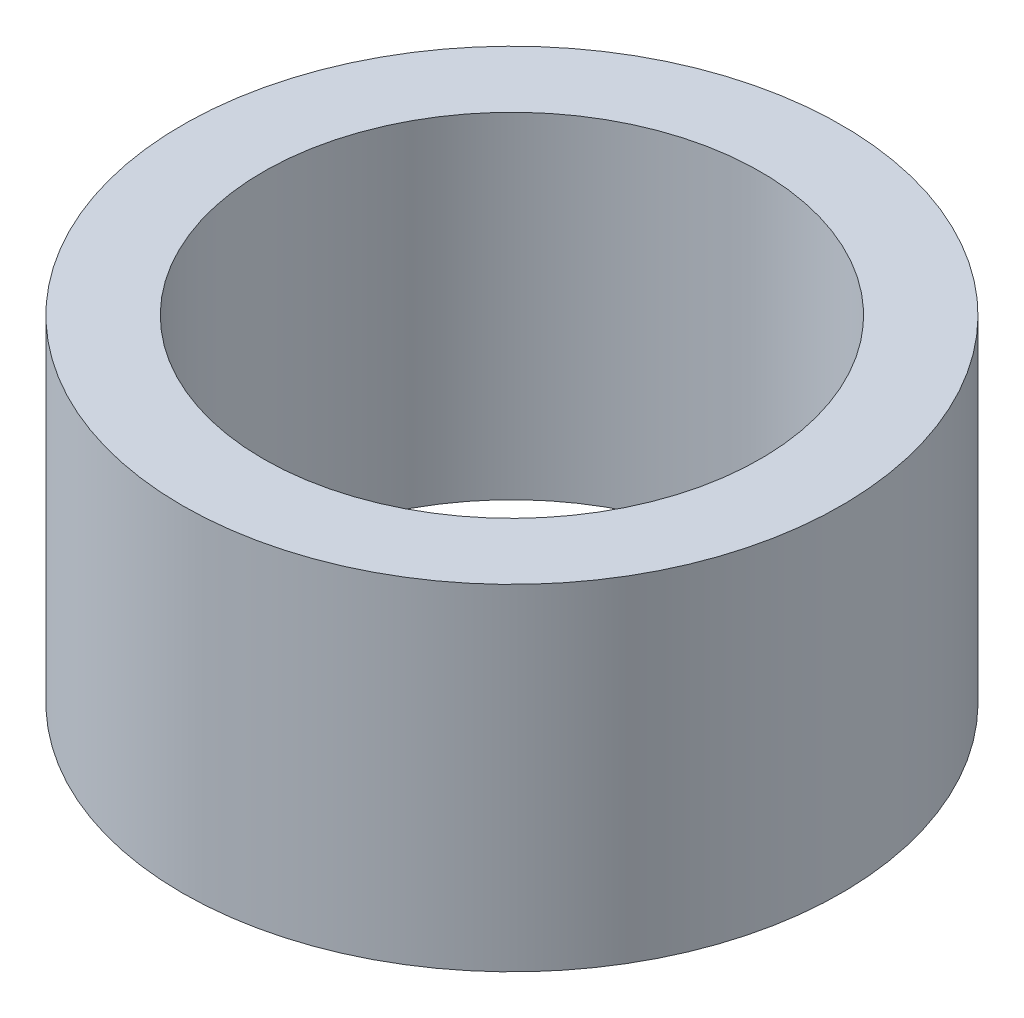
ISO-10303-21;
HEADER;
FILE_DESCRIPTION(('STEP AP214'),'2;1');
FILE_NAME('part.step','',(''),(''),'','','');
FILE_SCHEMA(('AUTOMOTIVE_DESIGN { 1 0 10303 214 1 1 1 1 }'));
ENDSEC;
DATA;
#1=APPLICATION_CONTEXT('core data for automotive mechanical design processes');
#2=APPLICATION_PROTOCOL_DEFINITION('international standard','automotive_design',2000,#1);
#3=PRODUCT_CONTEXT('',#1,'mechanical');
#4=PRODUCT('Part','Part','',(#3));
#5=PRODUCT_RELATED_PRODUCT_CATEGORY('part','',(#4));
#6=PRODUCT_DEFINITION_FORMATION('','',#4);
#7=PRODUCT_DEFINITION_CONTEXT('part definition',#1,'design');
#8=PRODUCT_DEFINITION('design','',#6,#7);
#9=PRODUCT_DEFINITION_SHAPE('','',#8);
#10=(LENGTH_UNIT() NAMED_UNIT(*) SI_UNIT(.MILLI.,.METRE.));
#11=(NAMED_UNIT(*) PLANE_ANGLE_UNIT() SI_UNIT($,.RADIAN.));
#12=(NAMED_UNIT(*) SI_UNIT($,.STERADIAN.) SOLID_ANGLE_UNIT());
#13=UNCERTAINTY_MEASURE_WITH_UNIT(LENGTH_MEASURE(1.E-05),#10,'distance_accuracy_value','');
#14=(GEOMETRIC_REPRESENTATION_CONTEXT(3) GLOBAL_UNCERTAINTY_ASSIGNED_CONTEXT((#13)) GLOBAL_UNIT_ASSIGNED_CONTEXT((#10,
#11,#12)) REPRESENTATION_CONTEXT('',''));
#15=CARTESIAN_POINT('',(0.,0.,0.));
#16=DIRECTION('',(0.,0.,1.));
#17=DIRECTION('',(1.,0.,0.));
#18=AXIS2_PLACEMENT_3D('',#15,#16,#17);
#19=CARTESIAN_POINT('',(0.,5.6,0.));
#20=DIRECTION('',(0.,1.,0.));
#21=DIRECTION('',(0.,0.,1.));
#22=AXIS2_PLACEMENT_3D('',#19,#20,#21);
#23=PLANE('',#22);
#24=CARTESIAN_POINT('',(0.,5.6,0.));
#25=DIRECTION('',(0.,1.,0.));
#26=DIRECTION('',(0.,0.,1.));
#27=AXIS2_PLACEMENT_3D('',#24,#25,#26);
#28=CIRCLE('',#27,5.5);
#29=CARTESIAN_POINT('',(0.,5.6,5.5));
#30=VERTEX_POINT('',#29);
#31=EDGE_CURVE('E10',#30,#30,#28,.T.);
#32=ORIENTED_EDGE('',*,*,#31,.T.);
#33=EDGE_LOOP('',(#32));
#34=FACE_BOUND('',#33,.T.);
#35=CARTESIAN_POINT('',(0.,5.6,0.));
#36=DIRECTION('',(0.,1.,0.));
#37=DIRECTION('',(0.,0.,1.));
#38=AXIS2_PLACEMENT_3D('',#35,#36,#37);
#39=CIRCLE('',#38,4.15);
#40=CARTESIAN_POINT('',(0.,5.6,4.15));
#41=VERTEX_POINT('',#40);
#42=EDGE_CURVE('E57',#41,#41,#39,.T.);
#43=ORIENTED_EDGE('',*,*,#42,.F.);
#44=EDGE_LOOP('',(#43));
#45=FACE_BOUND('',#44,.T.);
#46=ADVANCED_FACE('F43',(#34,#45),#23,.T.);
#47=CARTESIAN_POINT('',(0.,0.,0.));
#48=DIRECTION('',(0.,1.,0.));
#49=DIRECTION('',(0.,0.,1.));
#50=AXIS2_PLACEMENT_3D('',#47,#48,#49);
#51=PLANE('',#50);
#52=CARTESIAN_POINT('',(0.,0.,0.));
#53=DIRECTION('',(0.,1.,0.));
#54=DIRECTION('',(0.,0.,1.));
#55=AXIS2_PLACEMENT_3D('',#52,#53,#54);
#56=CIRCLE('',#55,5.5);
#57=CARTESIAN_POINT('',(0.,0.,5.5));
#58=VERTEX_POINT('',#57);
#59=EDGE_CURVE('E50',#58,#58,#56,.T.);
#60=ORIENTED_EDGE('',*,*,#59,.F.);
#61=EDGE_LOOP('',(#60));
#62=FACE_BOUND('',#61,.T.);
#63=CARTESIAN_POINT('',(0.,0.,0.));
#64=DIRECTION('',(0.,1.,0.));
#65=DIRECTION('',(0.,0.,1.));
#66=AXIS2_PLACEMENT_3D('',#63,#64,#65);
#67=CIRCLE('',#66,4.15);
#68=CARTESIAN_POINT('',(0.,0.,4.15));
#69=VERTEX_POINT('',#68);
#70=EDGE_CURVE('E59',#69,#69,#67,.T.);
#71=ORIENTED_EDGE('',*,*,#70,.T.);
#72=EDGE_LOOP('',(#71));
#73=FACE_BOUND('',#72,.T.);
#74=ADVANCED_FACE('F68',(#62,#73),#51,.F.);
#75=CARTESIAN_POINT('',(0.,5.6,0.));
#76=DIRECTION('',(0.,-1.,0.));
#77=DIRECTION('',(0.,0.,-1.));
#78=AXIS2_PLACEMENT_3D('',#75,#76,#77);
#79=CYLINDRICAL_SURFACE('',#78,5.5);
#80=ORIENTED_EDGE('',*,*,#31,.F.);
#81=EDGE_LOOP('',(#80));
#82=FACE_BOUND('',#81,.T.);
#83=ORIENTED_EDGE('',*,*,#59,.T.);
#84=EDGE_LOOP('',(#83));
#85=FACE_BOUND('',#84,.T.);
#86=ADVANCED_FACE('F44',(#82,#85),#79,.T.);
#87=CARTESIAN_POINT('',(0.,5.6,0.));
#88=DIRECTION('',(0.,-1.,0.));
#89=DIRECTION('',(0.,0.,-1.));
#90=AXIS2_PLACEMENT_3D('',#87,#88,#89);
#91=CYLINDRICAL_SURFACE('',#90,4.15);
#92=ORIENTED_EDGE('',*,*,#42,.T.);
#93=EDGE_LOOP('',(#92));
#94=FACE_BOUND('',#93,.T.);
#95=ORIENTED_EDGE('',*,*,#70,.F.);
#96=EDGE_LOOP('',(#95));
#97=FACE_BOUND('',#96,.T.);
#98=ADVANCED_FACE('F67',(#94,#97),#91,.F.);
#99=CLOSED_SHELL('',(#46,#74,#86,#98));
#100=MANIFOLD_SOLID_BREP('B2',#99);
#101=ADVANCED_BREP_SHAPE_REPRESENTATION('',(#18,#100),#14);
#102=SHAPE_DEFINITION_REPRESENTATION(#9,#101);
ENDSEC;
END-ISO-10303-21;
